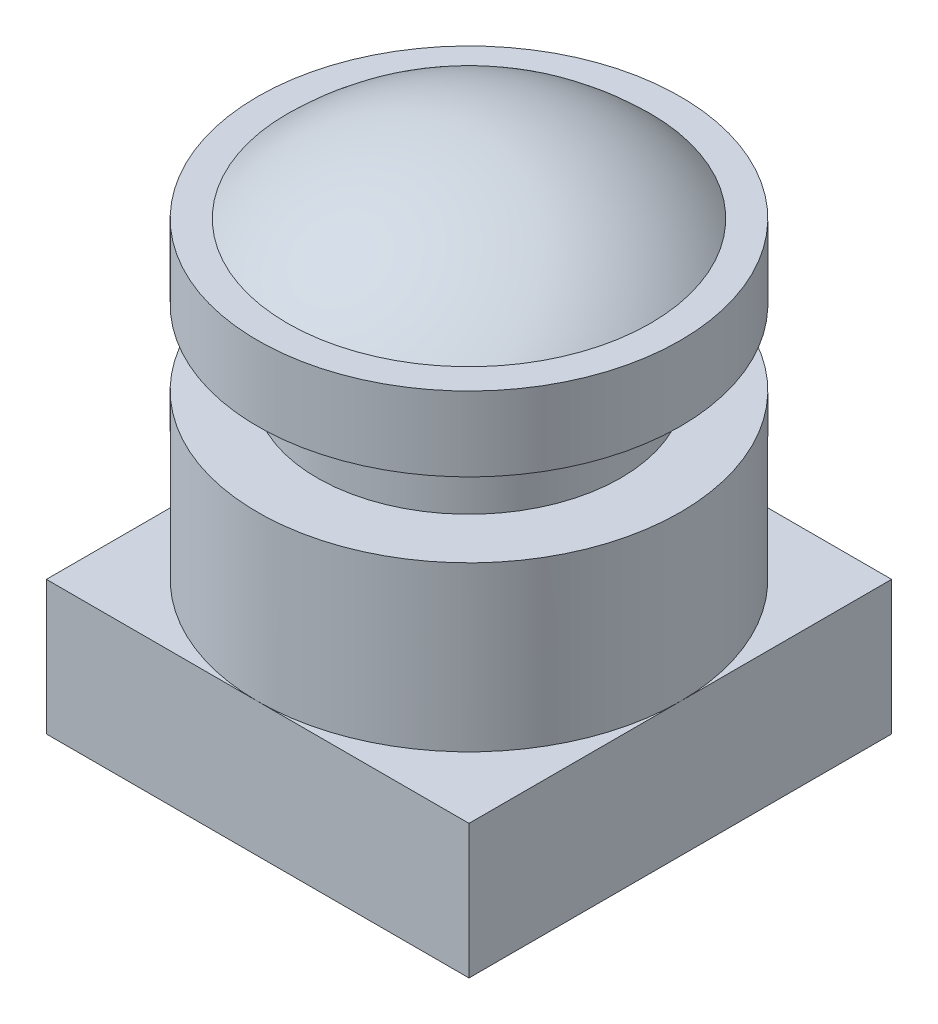
ISO-10303-21;
HEADER;
FILE_DESCRIPTION(('STEP AP214'),'2;1');
FILE_NAME('part.step','',(''),(''),'','','');
FILE_SCHEMA(('AUTOMOTIVE_DESIGN { 1 0 10303 214 1 1 1 1 }'));
ENDSEC;
DATA;
#1=APPLICATION_CONTEXT('core data for automotive mechanical design processes');
#2=APPLICATION_PROTOCOL_DEFINITION('international standard','automotive_design',2000,#1);
#3=PRODUCT_CONTEXT('',#1,'mechanical');
#4=PRODUCT('Part','Part','',(#3));
#5=PRODUCT_RELATED_PRODUCT_CATEGORY('part','',(#4));
#6=PRODUCT_DEFINITION_FORMATION('','',#4);
#7=PRODUCT_DEFINITION_CONTEXT('part definition',#1,'design');
#8=PRODUCT_DEFINITION('design','',#6,#7);
#9=PRODUCT_DEFINITION_SHAPE('','',#8);
#10=(LENGTH_UNIT() NAMED_UNIT(*) SI_UNIT(.MILLI.,.METRE.));
#11=(NAMED_UNIT(*) PLANE_ANGLE_UNIT() SI_UNIT($,.RADIAN.));
#12=(NAMED_UNIT(*) SI_UNIT($,.STERADIAN.) SOLID_ANGLE_UNIT());
#13=UNCERTAINTY_MEASURE_WITH_UNIT(LENGTH_MEASURE(1.E-05),#10,'distance_accuracy_value','');
#14=(GEOMETRIC_REPRESENTATION_CONTEXT(3) GLOBAL_UNCERTAINTY_ASSIGNED_CONTEXT((#13)) GLOBAL_UNIT_ASSIGNED_CONTEXT((#10,
#11,#12)) REPRESENTATION_CONTEXT('',''));
#15=CARTESIAN_POINT('',(0.,0.,0.));
#16=DIRECTION('',(0.,0.,1.));
#17=DIRECTION('',(1.,0.,0.));
#18=AXIS2_PLACEMENT_3D('',#15,#16,#17);
#19=CARTESIAN_POINT('',(0.,4.308,0.));
#20=DIRECTION('',(0.,-1.,0.));
#21=DIRECTION('',(1.,0.,0.));
#22=AXIS2_PLACEMENT_3D('',#19,#20,#21);
#23=SPHERICAL_SURFACE('',#22,8.692);
#24=CARTESIAN_POINT('',(0.,10.5,0.));
#25=DIRECTION('',(0.,-1.,0.));
#26=DIRECTION('',(1.,0.,0.));
#27=AXIS2_PLACEMENT_3D('',#24,#25,#26);
#28=CIRCLE('',#27,6.1);
#29=CARTESIAN_POINT('',(6.1,10.5,0.));
#30=VERTEX_POINT('',#29);
#31=EDGE_CURVE('E11',#30,#30,#28,.T.);
#32=ORIENTED_EDGE('',*,*,#31,.F.);
#33=EDGE_LOOP('',(#32));
#34=FACE_BOUND('',#33,.T.);
#35=ADVANCED_FACE('F43',(#34),#23,.T.);
#36=CARTESIAN_POINT('',(6.1,10.5,0.));
#37=DIRECTION('',(0.,1.,0.));
#38=DIRECTION('',(-1.,0.,0.));
#39=AXIS2_PLACEMENT_3D('',#36,#37,#38);
#40=PLANE('',#39);
#41=ORIENTED_EDGE('',*,*,#31,.T.);
#42=EDGE_LOOP('',(#41));
#43=FACE_BOUND('',#42,.T.);
#44=CARTESIAN_POINT('',(0.,10.5,0.));
#45=DIRECTION('',(0.,-1.,0.));
#46=DIRECTION('',(1.,0.,0.));
#47=AXIS2_PLACEMENT_3D('',#44,#45,#46);
#48=CIRCLE('',#47,7.1);
#49=CARTESIAN_POINT('',(7.1,10.5,0.));
#50=VERTEX_POINT('',#49);
#51=EDGE_CURVE('E51',#50,#50,#48,.T.);
#52=ORIENTED_EDGE('',*,*,#51,.F.);
#53=EDGE_LOOP('',(#52));
#54=FACE_BOUND('',#53,.T.);
#55=ADVANCED_FACE('F185',(#43,#54),#40,.T.);
#56=CARTESIAN_POINT('',(0.,0.,0.));
#57=DIRECTION('',(0.,-1.,0.));
#58=DIRECTION('',(1.,0.,0.));
#59=AXIS2_PLACEMENT_3D('',#56,#57,#58);
#60=CYLINDRICAL_SURFACE('',#59,7.1);
#61=ORIENTED_EDGE('',*,*,#51,.T.);
#62=EDGE_LOOP('',(#61));
#63=FACE_BOUND('',#62,.T.);
#64=CARTESIAN_POINT('',(0.,8.,0.));
#65=DIRECTION('',(0.,-1.,0.));
#66=DIRECTION('',(1.,0.,0.));
#67=AXIS2_PLACEMENT_3D('',#64,#65,#66);
#68=CIRCLE('',#67,7.1);
#69=CARTESIAN_POINT('',(7.1,8.,0.));
#70=VERTEX_POINT('',#69);
#71=EDGE_CURVE('E175',#70,#70,#68,.T.);
#72=ORIENTED_EDGE('',*,*,#71,.F.);
#73=EDGE_LOOP('',(#72));
#74=FACE_BOUND('',#73,.T.);
#75=ADVANCED_FACE('F182',(#63,#74),#60,.T.);
#76=CARTESIAN_POINT('',(7.1,8.,0.));
#77=DIRECTION('',(0.,-1.,0.));
#78=DIRECTION('',(1.,0.,0.));
#79=AXIS2_PLACEMENT_3D('',#76,#77,#78);
#80=PLANE('',#79);
#81=ORIENTED_EDGE('',*,*,#71,.T.);
#82=EDGE_LOOP('',(#81));
#83=FACE_BOUND('',#82,.T.);
#84=CARTESIAN_POINT('',(0.,8.,0.));
#85=DIRECTION('',(0.,-1.,0.));
#86=DIRECTION('',(1.,0.,0.));
#87=AXIS2_PLACEMENT_3D('',#84,#85,#86);
#88=CIRCLE('',#87,5.1);
#89=CARTESIAN_POINT('',(5.1,8.,0.));
#90=VERTEX_POINT('',#89);
#91=EDGE_CURVE('E171',#90,#90,#88,.T.);
#92=ORIENTED_EDGE('',*,*,#91,.F.);
#93=EDGE_LOOP('',(#92));
#94=FACE_BOUND('',#93,.T.);
#95=ADVANCED_FACE('F192',(#83,#94),#80,.T.);
#96=CARTESIAN_POINT('',(0.,0.,0.));
#97=DIRECTION('',(0.,-1.,0.));
#98=DIRECTION('',(1.,0.,0.));
#99=AXIS2_PLACEMENT_3D('',#96,#97,#98);
#100=CYLINDRICAL_SURFACE('',#99,5.1);
#101=ORIENTED_EDGE('',*,*,#91,.T.);
#102=EDGE_LOOP('',(#101));
#103=FACE_BOUND('',#102,.T.);
#104=CARTESIAN_POINT('',(0.,5.5,0.));
#105=DIRECTION('',(0.,-1.,0.));
#106=DIRECTION('',(1.,0.,0.));
#107=AXIS2_PLACEMENT_3D('',#104,#105,#106);
#108=CIRCLE('',#107,5.1);
#109=CARTESIAN_POINT('',(5.1,5.5,0.));
#110=VERTEX_POINT('',#109);
#111=EDGE_CURVE('E167',#110,#110,#108,.T.);
#112=ORIENTED_EDGE('',*,*,#111,.F.);
#113=EDGE_LOOP('',(#112));
#114=FACE_BOUND('',#113,.T.);
#115=ADVANCED_FACE('F198',(#103,#114),#100,.T.);
#116=CARTESIAN_POINT('',(5.1,5.5,0.));
#117=DIRECTION('',(0.,1.,0.));
#118=DIRECTION('',(-1.,0.,0.));
#119=AXIS2_PLACEMENT_3D('',#116,#117,#118);
#120=PLANE('',#119);
#121=ORIENTED_EDGE('',*,*,#111,.T.);
#122=EDGE_LOOP('',(#121));
#123=FACE_BOUND('',#122,.T.);
#124=CARTESIAN_POINT('',(0.,5.5,0.));
#125=DIRECTION('',(0.,-1.,0.));
#126=DIRECTION('',(1.,0.,0.));
#127=AXIS2_PLACEMENT_3D('',#124,#125,#126);
#128=CIRCLE('',#127,7.1);
#129=CARTESIAN_POINT('',(7.1,5.5,0.));
#130=VERTEX_POINT('',#129);
#131=EDGE_CURVE('E162',#130,#130,#128,.T.);
#132=ORIENTED_EDGE('',*,*,#131,.F.);
#133=EDGE_LOOP('',(#132));
#134=FACE_BOUND('',#133,.T.);
#135=ADVANCED_FACE('F202',(#123,#134),#120,.T.);
#136=CARTESIAN_POINT('',(0.,0.,0.));
#137=DIRECTION('',(0.,-1.,0.));
#138=DIRECTION('',(1.,0.,0.));
#139=AXIS2_PLACEMENT_3D('',#136,#137,#138);
#140=CYLINDRICAL_SURFACE('',#139,7.1);
#141=ORIENTED_EDGE('',*,*,#131,.T.);
#142=EDGE_LOOP('',(#141));
#143=FACE_BOUND('',#142,.T.);
#144=CARTESIAN_POINT('',(0.,0.,0.));
#145=DIRECTION('',(0.,-1.,0.));
#146=DIRECTION('',(1.,0.,0.));
#147=AXIS2_PLACEMENT_3D('',#144,#145,#146);
#148=CIRCLE('',#147,7.1);
#149=CARTESIAN_POINT('',(7.1,0.,0.));
#150=VERTEX_POINT('',#149);
#151=CARTESIAN_POINT('',(0.,0.,7.1));
#152=VERTEX_POINT('',#151);
#153=EDGE_CURVE('E158',#150,#152,#148,.T.);
#154=ORIENTED_EDGE('',*,*,#153,.F.);
#155=CARTESIAN_POINT('',(0.,0.,-7.1));
#156=VERTEX_POINT('',#155);
#157=EDGE_CURVE('E58',#156,#150,#148,.T.);
#158=ORIENTED_EDGE('',*,*,#157,.F.);
#159=CARTESIAN_POINT('',(-7.1,0.,0.));
#160=VERTEX_POINT('',#159);
#161=EDGE_CURVE('E62',#160,#156,#148,.T.);
#162=ORIENTED_EDGE('',*,*,#161,.F.);
#163=EDGE_CURVE('E163',#152,#160,#148,.T.);
#164=ORIENTED_EDGE('',*,*,#163,.F.);
#165=EDGE_LOOP('',(#154,#158,#162,#164));
#166=FACE_BOUND('',#165,.T.);
#167=ADVANCED_FACE('F206',(#143,#166),#140,.T.);
#168=CARTESIAN_POINT('',(0.,0.,0.));
#169=DIRECTION('',(0.,1.,0.));
#170=DIRECTION('',(0.,0.,1.));
#171=AXIS2_PLACEMENT_3D('',#168,#169,#170);
#172=PLANE('',#171);
#173=DIRECTION('',(0.,0.,-1.));
#174=VECTOR('',#173,1.);
#175=CARTESIAN_POINT('',(7.1,0.,-7.1));
#176=LINE('',#175,#174);
#177=CARTESIAN_POINT('',(7.1,0.,7.1));
#178=VERTEX_POINT('',#177);
#179=EDGE_CURVE('E137',#178,#150,#176,.T.);
#180=ORIENTED_EDGE('',*,*,#179,.T.);
#181=ORIENTED_EDGE('',*,*,#153,.T.);
#182=DIRECTION('',(1.,0.,0.));
#183=VECTOR('',#182,1.);
#184=CARTESIAN_POINT('',(-7.1,0.,7.1));
#185=LINE('',#184,#183);
#186=EDGE_CURVE('E130',#152,#178,#185,.T.);
#187=ORIENTED_EDGE('',*,*,#186,.T.);
#188=EDGE_LOOP('',(#180,#181,#187));
#189=FACE_BOUND('',#188,.T.);
#190=ADVANCED_FACE('F210',(#189),#172,.T.);
#191=CARTESIAN_POINT('',(-7.1,0.,7.1));
#192=VERTEX_POINT('',#191);
#193=EDGE_CURVE('E126',#192,#152,#185,.T.);
#194=ORIENTED_EDGE('',*,*,#193,.T.);
#195=ORIENTED_EDGE('',*,*,#163,.T.);
#196=DIRECTION('',(0.,0.,1.));
#197=VECTOR('',#196,1.);
#198=CARTESIAN_POINT('',(-7.1,0.,-7.1));
#199=LINE('',#198,#197);
#200=EDGE_CURVE('E145',#160,#192,#199,.T.);
#201=ORIENTED_EDGE('',*,*,#200,.T.);
#202=EDGE_LOOP('',(#194,#195,#201));
#203=FACE_BOUND('',#202,.T.);
#204=ADVANCED_FACE('F247',(#203),#172,.T.);
#205=CARTESIAN_POINT('',(-7.1,0.,-7.1));
#206=VERTEX_POINT('',#205);
#207=EDGE_CURVE('E146',#206,#160,#199,.T.);
#208=ORIENTED_EDGE('',*,*,#207,.T.);
#209=ORIENTED_EDGE('',*,*,#161,.T.);
#210=DIRECTION('',(-1.,0.,0.));
#211=VECTOR('',#210,1.);
#212=CARTESIAN_POINT('',(-7.1,0.,-7.1));
#213=LINE('',#212,#211);
#214=EDGE_CURVE('E141',#156,#206,#213,.T.);
#215=ORIENTED_EDGE('',*,*,#214,.T.);
#216=EDGE_LOOP('',(#208,#209,#215));
#217=FACE_BOUND('',#216,.T.);
#218=ADVANCED_FACE('F215',(#217),#172,.T.);
#219=CARTESIAN_POINT('',(7.1,-4.5,-7.1));
#220=DIRECTION('',(1.,0.,0.));
#221=DIRECTION('',(0.,0.,-1.));
#222=AXIS2_PLACEMENT_3D('',#219,#220,#221);
#223=PLANE('',#222);
#224=ORIENTED_EDGE('',*,*,#179,.F.);
#225=DIRECTION('',(0.,1.,0.));
#226=VECTOR('',#225,1.);
#227=CARTESIAN_POINT('',(7.1,-4.5,7.1));
#228=LINE('',#227,#226);
#229=CARTESIAN_POINT('',(7.1,-4.5,7.1));
#230=VERTEX_POINT('',#229);
#231=EDGE_CURVE('E124',#230,#178,#228,.T.);
#232=ORIENTED_EDGE('',*,*,#231,.F.);
#233=DIRECTION('',(0.,0.,-1.));
#234=VECTOR('',#233,1.);
#235=CARTESIAN_POINT('',(7.1,-4.5,-7.1));
#236=LINE('',#235,#234);
#237=CARTESIAN_POINT('',(7.1,-4.5,-7.1));
#238=VERTEX_POINT('',#237);
#239=EDGE_CURVE('E115',#230,#238,#236,.T.);
#240=ORIENTED_EDGE('',*,*,#239,.T.);
#241=DIRECTION('',(0.,1.,0.));
#242=VECTOR('',#241,1.);
#243=CARTESIAN_POINT('',(7.1,-4.5,-7.1));
#244=LINE('',#243,#242);
#245=CARTESIAN_POINT('',(7.1,0.,-7.1));
#246=VERTEX_POINT('',#245);
#247=EDGE_CURVE('E95',#238,#246,#244,.T.);
#248=ORIENTED_EDGE('',*,*,#247,.T.);
#249=EDGE_CURVE('E142',#150,#246,#176,.T.);
#250=ORIENTED_EDGE('',*,*,#249,.F.);
#251=EDGE_LOOP('',(#224,#232,#240,#248,#250));
#252=FACE_BOUND('',#251,.T.);
#253=ADVANCED_FACE('F122',(#252),#223,.T.);
#254=CARTESIAN_POINT('',(-7.1,-4.5,7.1));
#255=DIRECTION('',(0.,0.,1.));
#256=DIRECTION('',(1.,0.,0.));
#257=AXIS2_PLACEMENT_3D('',#254,#255,#256);
#258=PLANE('',#257);
#259=ORIENTED_EDGE('',*,*,#193,.F.);
#260=DIRECTION('',(0.,1.,0.));
#261=VECTOR('',#260,1.);
#262=CARTESIAN_POINT('',(-7.1,-4.5,7.1));
#263=LINE('',#262,#261);
#264=CARTESIAN_POINT('',(-7.1,-4.5,7.1));
#265=VERTEX_POINT('',#264);
#266=EDGE_CURVE('E152',#265,#192,#263,.T.);
#267=ORIENTED_EDGE('',*,*,#266,.F.);
#268=DIRECTION('',(1.,0.,0.));
#269=VECTOR('',#268,1.);
#270=CARTESIAN_POINT('',(-7.1,-4.5,7.1));
#271=LINE('',#270,#269);
#272=EDGE_CURVE('E108',#265,#230,#271,.T.);
#273=ORIENTED_EDGE('',*,*,#272,.T.);
#274=ORIENTED_EDGE('',*,*,#231,.T.);
#275=ORIENTED_EDGE('',*,*,#186,.F.);
#276=EDGE_LOOP('',(#259,#267,#273,#274,#275));
#277=FACE_BOUND('',#276,.T.);
#278=ADVANCED_FACE('F214',(#277),#258,.T.);
#279=CARTESIAN_POINT('',(-7.1,-4.5,-7.1));
#280=DIRECTION('',(-1.,0.,0.));
#281=DIRECTION('',(0.,0.,1.));
#282=AXIS2_PLACEMENT_3D('',#279,#280,#281);
#283=PLANE('',#282);
#284=ORIENTED_EDGE('',*,*,#207,.F.);
#285=DIRECTION('',(0.,1.,0.));
#286=VECTOR('',#285,1.);
#287=CARTESIAN_POINT('',(-7.1,-4.5,-7.1));
#288=LINE('',#287,#286);
#289=CARTESIAN_POINT('',(-7.1,-4.5,-7.1));
#290=VERTEX_POINT('',#289);
#291=EDGE_CURVE('E107',#290,#206,#288,.T.);
#292=ORIENTED_EDGE('',*,*,#291,.F.);
#293=DIRECTION('',(0.,0.,1.));
#294=VECTOR('',#293,1.);
#295=CARTESIAN_POINT('',(-7.1,-4.5,-7.1));
#296=LINE('',#295,#294);
#297=EDGE_CURVE('E118',#290,#265,#296,.T.);
#298=ORIENTED_EDGE('',*,*,#297,.T.);
#299=ORIENTED_EDGE('',*,*,#266,.T.);
#300=ORIENTED_EDGE('',*,*,#200,.F.);
#301=EDGE_LOOP('',(#284,#292,#298,#299,#300));
#302=FACE_BOUND('',#301,.T.);
#303=ADVANCED_FACE('F218',(#302),#283,.T.);
#304=CARTESIAN_POINT('',(-7.1,-4.5,-7.1));
#305=DIRECTION('',(0.,0.,-1.));
#306=DIRECTION('',(-1.,0.,0.));
#307=AXIS2_PLACEMENT_3D('',#304,#305,#306);
#308=PLANE('',#307);
#309=EDGE_CURVE('E102',#246,#156,#213,.T.);
#310=ORIENTED_EDGE('',*,*,#309,.F.);
#311=ORIENTED_EDGE('',*,*,#247,.F.);
#312=DIRECTION('',(-1.,0.,0.));
#313=VECTOR('',#312,1.);
#314=CARTESIAN_POINT('',(-7.1,-4.5,-7.1));
#315=LINE('',#314,#313);
#316=EDGE_CURVE('E99',#238,#290,#315,.T.);
#317=ORIENTED_EDGE('',*,*,#316,.T.);
#318=ORIENTED_EDGE('',*,*,#291,.T.);
#319=ORIENTED_EDGE('',*,*,#214,.F.);
#320=EDGE_LOOP('',(#310,#311,#317,#318,#319));
#321=FACE_BOUND('',#320,.T.);
#322=ADVANCED_FACE('F97',(#321),#308,.T.);
#323=CARTESIAN_POINT('',(0.,-4.5,0.));
#324=DIRECTION('',(0.,1.,0.));
#325=DIRECTION('',(0.,0.,1.));
#326=AXIS2_PLACEMENT_3D('',#323,#324,#325);
#327=PLANE('',#326);
#328=ORIENTED_EDGE('',*,*,#239,.F.);
#329=ORIENTED_EDGE('',*,*,#272,.F.);
#330=ORIENTED_EDGE('',*,*,#297,.F.);
#331=ORIENTED_EDGE('',*,*,#316,.F.);
#332=EDGE_LOOP('',(#328,#329,#330,#331));
#333=FACE_BOUND('',#332,.T.);
#334=ADVANCED_FACE('F113',(#333),#327,.F.);
#335=ORIENTED_EDGE('',*,*,#309,.T.);
#336=ORIENTED_EDGE('',*,*,#157,.T.);
#337=ORIENTED_EDGE('',*,*,#249,.T.);
#338=EDGE_LOOP('',(#335,#336,#337));
#339=FACE_BOUND('',#338,.T.);
#340=ADVANCED_FACE('F225',(#339),#172,.T.);
#341=CLOSED_SHELL('',(#35,#55,#75,#95,#115,#135,#167,#190,#204,#218,#253,#278,#303,#322,#334,#340));
#342=MANIFOLD_SOLID_BREP('B2',#341);
#343=ADVANCED_BREP_SHAPE_REPRESENTATION('',(#18,#342),#14);
#344=SHAPE_DEFINITION_REPRESENTATION(#9,#343);
ENDSEC;
END-ISO-10303-21;
